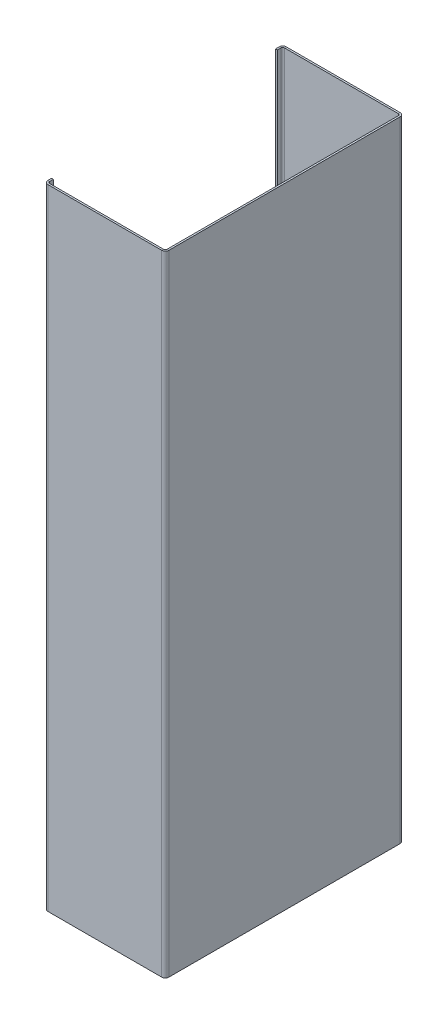
ISO-10303-21;
HEADER;
FILE_DESCRIPTION(('STEP AP214'),'2;1');
FILE_NAME('part.step','',(''),(''),'','','');
FILE_SCHEMA(('AUTOMOTIVE_DESIGN { 1 0 10303 214 1 1 1 1 }'));
ENDSEC;
DATA;
#1=APPLICATION_CONTEXT('core data for automotive mechanical design processes');
#2=APPLICATION_PROTOCOL_DEFINITION('international standard','automotive_design',2000,#1);
#3=PRODUCT_CONTEXT('',#1,'mechanical');
#4=PRODUCT('Part','Part','',(#3));
#5=PRODUCT_RELATED_PRODUCT_CATEGORY('part','',(#4));
#6=PRODUCT_DEFINITION_FORMATION('','',#4);
#7=PRODUCT_DEFINITION_CONTEXT('part definition',#1,'design');
#8=PRODUCT_DEFINITION('design','',#6,#7);
#9=PRODUCT_DEFINITION_SHAPE('','',#8);
#10=(LENGTH_UNIT() NAMED_UNIT(*) SI_UNIT(.MILLI.,.METRE.));
#11=(NAMED_UNIT(*) PLANE_ANGLE_UNIT() SI_UNIT($,.RADIAN.));
#12=(NAMED_UNIT(*) SI_UNIT($,.STERADIAN.) SOLID_ANGLE_UNIT());
#13=UNCERTAINTY_MEASURE_WITH_UNIT(LENGTH_MEASURE(1.E-05),#10,'distance_accuracy_value','');
#14=(GEOMETRIC_REPRESENTATION_CONTEXT(3) GLOBAL_UNCERTAINTY_ASSIGNED_CONTEXT((#13)) GLOBAL_UNIT_ASSIGNED_CONTEXT((#10,
#11,#12)) REPRESENTATION_CONTEXT('',''));
#15=CARTESIAN_POINT('',(0.,0.,0.));
#16=DIRECTION('',(0.,0.,1.));
#17=DIRECTION('',(1.,0.,0.));
#18=AXIS2_PLACEMENT_3D('',#15,#16,#17);
#19=CARTESIAN_POINT('',(-50.,260.,47.75));
#20=DIRECTION('',(0.,1.,0.));
#21=DIRECTION('',(0.,0.,1.));
#22=AXIS2_PLACEMENT_3D('',#19,#20,#21);
#23=PLANE('',#22);
#24=DIRECTION('',(1.,0.,0.));
#25=VECTOR('',#24,1.);
#26=CARTESIAN_POINT('',(-50.,260.,47.75));
#27=LINE('',#26,#25);
#28=CARTESIAN_POINT('',(-50.,260.,47.75));
#29=VERTEX_POINT('',#28);
#30=CARTESIAN_POINT('',(-49.25,260.,47.75));
#31=VERTEX_POINT('',#30);
#32=EDGE_CURVE('E11',#29,#31,#27,.T.);
#33=ORIENTED_EDGE('',*,*,#32,.F.);
#34=CARTESIAN_POINT('',(-48.5,260.,47.75));
#35=DIRECTION('',(0.,-1.,0.));
#36=DIRECTION('',(0.,0.,-1.));
#37=AXIS2_PLACEMENT_3D('',#34,#35,#36);
#38=CIRCLE('',#37,1.5);
#39=CARTESIAN_POINT('',(-48.5,260.,49.25));
#40=VERTEX_POINT('',#39);
#41=EDGE_CURVE('E364',#29,#40,#38,.F.);
#42=ORIENTED_EDGE('',*,*,#41,.T.);
#43=DIRECTION('',(0.,0.,1.));
#44=VECTOR('',#43,1.);
#45=CARTESIAN_POINT('',(-48.5,260.,48.5));
#46=LINE('',#45,#44);
#47=CARTESIAN_POINT('',(-48.5,260.,48.5));
#48=VERTEX_POINT('',#47);
#49=EDGE_CURVE('E47',#48,#40,#46,.T.);
#50=ORIENTED_EDGE('',*,*,#49,.F.);
#51=CARTESIAN_POINT('',(-48.5,260.,47.75));
#52=DIRECTION('',(0.,1.,0.));
#53=DIRECTION('',(1.,0.,0.));
#54=AXIS2_PLACEMENT_3D('',#51,#52,#53);
#55=CIRCLE('',#54,0.75);
#56=EDGE_CURVE('E439',#31,#48,#55,.T.);
#57=ORIENTED_EDGE('',*,*,#56,.F.);
#58=EDGE_LOOP('',(#33,#42,#50,#57));
#59=FACE_BOUND('',#58,.T.);
#60=ADVANCED_FACE('F39',(#59),#23,.T.);
#61=CARTESIAN_POINT('',(-48.5,260.,48.5));
#62=DIRECTION('',(0.,1.,0.));
#63=DIRECTION('',(0.,0.,1.));
#64=AXIS2_PLACEMENT_3D('',#61,#62,#63);
#65=PLANE('',#64);
#66=DIRECTION('',(0.,0.,1.));
#67=VECTOR('',#66,1.);
#68=CARTESIAN_POINT('',(-50.,260.,49.25));
#69=LINE('',#68,#67);
#70=CARTESIAN_POINT('',(-50.,260.,46.25));
#71=VERTEX_POINT('',#70);
#72=EDGE_CURVE('E368',#71,#29,#69,.T.);
#73=ORIENTED_EDGE('',*,*,#72,.T.);
#74=ORIENTED_EDGE('',*,*,#32,.T.);
#75=DIRECTION('',(0.,0.,-1.));
#76=VECTOR('',#75,1.);
#77=CARTESIAN_POINT('',(-49.25,260.,49.25));
#78=LINE('',#77,#76);
#79=CARTESIAN_POINT('',(-49.25,260.,46.25));
#80=VERTEX_POINT('',#79);
#81=EDGE_CURVE('E441',#80,#31,#78,.F.);
#82=ORIENTED_EDGE('',*,*,#81,.F.);
#83=DIRECTION('',(1.,0.,0.));
#84=VECTOR('',#83,1.);
#85=CARTESIAN_POINT('',(-50.,260.,46.25));
#86=LINE('',#85,#84);
#87=EDGE_CURVE('E444',#71,#80,#86,.T.);
#88=ORIENTED_EDGE('',*,*,#87,.F.);
#89=EDGE_LOOP('',(#73,#74,#82,#88));
#90=FACE_BOUND('',#89,.T.);
#91=ADVANCED_FACE('F450',(#90),#65,.T.);
#92=CARTESIAN_POINT('',(-48.5,0.,49.25));
#93=DIRECTION('',(0.,-1.,0.));
#94=DIRECTION('',(0.,0.,-1.));
#95=AXIS2_PLACEMENT_3D('',#92,#93,#94);
#96=PLANE('',#95);
#97=DIRECTION('',(0.,0.,-1.));
#98=VECTOR('',#97,1.);
#99=CARTESIAN_POINT('',(-48.5,0.,49.25));
#100=LINE('',#99,#98);
#101=CARTESIAN_POINT('',(-48.5,0.,49.25));
#102=VERTEX_POINT('',#101);
#103=CARTESIAN_POINT('',(-48.5,0.,48.5));
#104=VERTEX_POINT('',#103);
#105=EDGE_CURVE('E348',#102,#104,#100,.T.);
#106=ORIENTED_EDGE('',*,*,#105,.F.);
#107=CARTESIAN_POINT('',(-48.5,0.,47.75));
#108=DIRECTION('',(0.,-1.,0.));
#109=DIRECTION('',(0.,0.,-1.));
#110=AXIS2_PLACEMENT_3D('',#107,#108,#109);
#111=CIRCLE('',#110,1.5);
#112=CARTESIAN_POINT('',(-50.,0.,47.75));
#113=VERTEX_POINT('',#112);
#114=EDGE_CURVE('E264',#113,#102,#111,.F.);
#115=ORIENTED_EDGE('',*,*,#114,.F.);
#116=DIRECTION('',(-1.,0.,0.));
#117=VECTOR('',#116,1.);
#118=CARTESIAN_POINT('',(-49.25,0.,47.75));
#119=LINE('',#118,#117);
#120=CARTESIAN_POINT('',(-49.25,0.,47.75));
#121=VERTEX_POINT('',#120);
#122=EDGE_CURVE('E346',#121,#113,#119,.T.);
#123=ORIENTED_EDGE('',*,*,#122,.F.);
#124=CARTESIAN_POINT('',(-48.5,0.,47.75));
#125=DIRECTION('',(0.,1.,0.));
#126=DIRECTION('',(1.,0.,0.));
#127=AXIS2_PLACEMENT_3D('',#124,#125,#126);
#128=CIRCLE('',#127,0.75);
#129=EDGE_CURVE('E252',#121,#104,#128,.T.);
#130=ORIENTED_EDGE('',*,*,#129,.T.);
#131=EDGE_LOOP('',(#106,#115,#123,#130));
#132=FACE_BOUND('',#131,.T.);
#133=ADVANCED_FACE('F457',(#132),#96,.T.);
#134=CARTESIAN_POINT('',(-49.25,0.,47.75));
#135=DIRECTION('',(0.,-1.,0.));
#136=DIRECTION('',(0.,0.,-1.));
#137=AXIS2_PLACEMENT_3D('',#134,#135,#136);
#138=PLANE('',#137);
#139=DIRECTION('',(1.,0.,0.));
#140=VECTOR('',#139,1.);
#141=CARTESIAN_POINT('',(0.,0.,49.25));
#142=LINE('',#141,#140);
#143=CARTESIAN_POINT('',(-1.49999999999998,0.,49.25));
#144=VERTEX_POINT('',#143);
#145=EDGE_CURVE('E267',#102,#144,#142,.T.);
#146=ORIENTED_EDGE('',*,*,#145,.F.);
#147=ORIENTED_EDGE('',*,*,#105,.T.);
#148=DIRECTION('',(1.,0.,0.));
#149=VECTOR('',#148,1.);
#150=CARTESIAN_POINT('',(0.,0.,48.5));
#151=LINE('',#150,#149);
#152=CARTESIAN_POINT('',(-1.49999999999998,0.,48.5));
#153=VERTEX_POINT('',#152);
#154=EDGE_CURVE('E249',#104,#153,#151,.T.);
#155=ORIENTED_EDGE('',*,*,#154,.T.);
#156=DIRECTION('',(0.,0.,1.));
#157=VECTOR('',#156,1.);
#158=CARTESIAN_POINT('',(-1.49999999999998,0.,48.5));
#159=LINE('',#158,#157);
#160=EDGE_CURVE('E338',#153,#144,#159,.T.);
#161=ORIENTED_EDGE('',*,*,#160,.T.);
#162=EDGE_LOOP('',(#146,#147,#155,#161));
#163=FACE_BOUND('',#162,.T.);
#164=ADVANCED_FACE('F460',(#163),#138,.T.);
#165=CARTESIAN_POINT('',(-1.49999999999998,260.,49.25));
#166=DIRECTION('',(0.,1.,0.));
#167=DIRECTION('',(0.,0.,1.));
#168=AXIS2_PLACEMENT_3D('',#165,#166,#167);
#169=PLANE('',#168);
#170=DIRECTION('',(0.,0.,-1.));
#171=VECTOR('',#170,1.);
#172=CARTESIAN_POINT('',(-1.49999999999998,260.,49.25));
#173=LINE('',#172,#171);
#174=CARTESIAN_POINT('',(-1.49999999999998,260.,49.25));
#175=VERTEX_POINT('',#174);
#176=CARTESIAN_POINT('',(-1.49999999999998,260.,48.5));
#177=VERTEX_POINT('',#176);
#178=EDGE_CURVE('E344',#175,#177,#173,.T.);
#179=ORIENTED_EDGE('',*,*,#178,.F.);
#180=CARTESIAN_POINT('',(-1.49999999999998,260.,47.75));
#181=DIRECTION('',(0.,-1.,0.));
#182=DIRECTION('',(0.,0.,-1.));
#183=AXIS2_PLACEMENT_3D('',#180,#181,#182);
#184=CIRCLE('',#183,1.5);
#185=CARTESIAN_POINT('',(0.,260.,47.75));
#186=VERTEX_POINT('',#185);
#187=EDGE_CURVE('E376',#175,#186,#184,.F.);
#188=ORIENTED_EDGE('',*,*,#187,.T.);
#189=DIRECTION('',(1.,0.,0.));
#190=VECTOR('',#189,1.);
#191=CARTESIAN_POINT('',(-0.749999999999984,260.,47.75));
#192=LINE('',#191,#190);
#193=CARTESIAN_POINT('',(-0.749999999999984,260.,47.75));
#194=VERTEX_POINT('',#193);
#195=EDGE_CURVE('E342',#194,#186,#192,.T.);
#196=ORIENTED_EDGE('',*,*,#195,.F.);
#197=CARTESIAN_POINT('',(-1.49999999999998,260.,47.75));
#198=DIRECTION('',(0.,1.,0.));
#199=DIRECTION('',(1.,0.,0.));
#200=AXIS2_PLACEMENT_3D('',#197,#198,#199);
#201=CIRCLE('',#200,0.75);
#202=EDGE_CURVE('E435',#177,#194,#201,.T.);
#203=ORIENTED_EDGE('',*,*,#202,.F.);
#204=EDGE_LOOP('',(#179,#188,#196,#203));
#205=FACE_BOUND('',#204,.T.);
#206=ADVANCED_FACE('F480',(#205),#169,.T.);
#207=CARTESIAN_POINT('',(-0.749999999999984,260.,47.75));
#208=DIRECTION('',(0.,1.,0.));
#209=DIRECTION('',(0.,0.,1.));
#210=AXIS2_PLACEMENT_3D('',#207,#208,#209);
#211=PLANE('',#210);
#212=DIRECTION('',(1.,0.,0.));
#213=VECTOR('',#212,1.);
#214=CARTESIAN_POINT('',(0.,260.,49.25));
#215=LINE('',#214,#213);
#216=EDGE_CURVE('E355',#40,#175,#215,.T.);
#217=ORIENTED_EDGE('',*,*,#216,.T.);
#218=ORIENTED_EDGE('',*,*,#178,.T.);
#219=DIRECTION('',(1.,0.,0.));
#220=VECTOR('',#219,1.);
#221=CARTESIAN_POINT('',(0.,260.,48.5));
#222=LINE('',#221,#220);
#223=EDGE_CURVE('E358',#48,#177,#222,.T.);
#224=ORIENTED_EDGE('',*,*,#223,.F.);
#225=ORIENTED_EDGE('',*,*,#49,.T.);
#226=EDGE_LOOP('',(#217,#218,#224,#225));
#227=FACE_BOUND('',#226,.T.);
#228=ADVANCED_FACE('F353',(#227),#211,.T.);
#229=CARTESIAN_POINT('',(0.,0.,47.75));
#230=DIRECTION('',(0.,-1.,0.));
#231=DIRECTION('',(0.,0.,-1.));
#232=AXIS2_PLACEMENT_3D('',#229,#230,#231);
#233=PLANE('',#232);
#234=DIRECTION('',(-1.,0.,0.));
#235=VECTOR('',#234,1.);
#236=CARTESIAN_POINT('',(0.,0.,47.75));
#237=LINE('',#236,#235);
#238=CARTESIAN_POINT('',(0.,0.,47.75));
#239=VERTEX_POINT('',#238);
#240=CARTESIAN_POINT('',(-0.749999999999984,0.,47.75));
#241=VERTEX_POINT('',#240);
#242=EDGE_CURVE('E340',#239,#241,#237,.T.);
#243=ORIENTED_EDGE('',*,*,#242,.F.);
#244=CARTESIAN_POINT('',(-1.49999999999998,0.,47.75));
#245=DIRECTION('',(0.,-1.,0.));
#246=DIRECTION('',(0.,0.,-1.));
#247=AXIS2_PLACEMENT_3D('',#244,#245,#246);
#248=CIRCLE('',#247,1.5);
#249=EDGE_CURVE('E270',#144,#239,#248,.F.);
#250=ORIENTED_EDGE('',*,*,#249,.F.);
#251=ORIENTED_EDGE('',*,*,#160,.F.);
#252=CARTESIAN_POINT('',(-1.49999999999998,0.,47.75));
#253=DIRECTION('',(0.,1.,0.));
#254=DIRECTION('',(1.,0.,0.));
#255=AXIS2_PLACEMENT_3D('',#252,#253,#254);
#256=CIRCLE('',#255,0.75);
#257=EDGE_CURVE('E246',#153,#241,#256,.T.);
#258=ORIENTED_EDGE('',*,*,#257,.T.);
#259=EDGE_LOOP('',(#243,#250,#251,#258));
#260=FACE_BOUND('',#259,.T.);
#261=ADVANCED_FACE('F474',(#260),#233,.T.);
#262=CARTESIAN_POINT('',(-1.49999999999998,0.,48.5));
#263=DIRECTION('',(0.,-1.,0.));
#264=DIRECTION('',(0.,0.,-1.));
#265=AXIS2_PLACEMENT_3D('',#262,#263,#264);
#266=PLANE('',#265);
#267=DIRECTION('',(0.,0.,-1.));
#268=VECTOR('',#267,1.);
#269=CARTESIAN_POINT('',(0.,0.,-49.25));
#270=LINE('',#269,#268);
#271=CARTESIAN_POINT('',(0.,0.,-47.75));
#272=VERTEX_POINT('',#271);
#273=EDGE_CURVE('E273',#239,#272,#270,.T.);
#274=ORIENTED_EDGE('',*,*,#273,.F.);
#275=ORIENTED_EDGE('',*,*,#242,.T.);
#276=DIRECTION('',(0.,0.,-1.));
#277=VECTOR('',#276,1.);
#278=CARTESIAN_POINT('',(-0.750000000000038,0.,-49.25));
#279=LINE('',#278,#277);
#280=CARTESIAN_POINT('',(-0.750000000000037,0.,-47.75));
#281=VERTEX_POINT('',#280);
#282=EDGE_CURVE('E243',#241,#281,#279,.T.);
#283=ORIENTED_EDGE('',*,*,#282,.T.);
#284=DIRECTION('',(1.,0.,0.));
#285=VECTOR('',#284,1.);
#286=CARTESIAN_POINT('',(-0.750000000000037,0.,-47.75));
#287=LINE('',#286,#285);
#288=EDGE_CURVE('E334',#281,#272,#287,.T.);
#289=ORIENTED_EDGE('',*,*,#288,.T.);
#290=EDGE_LOOP('',(#274,#275,#283,#289));
#291=FACE_BOUND('',#290,.T.);
#292=ADVANCED_FACE('F484',(#291),#266,.T.);
#293=CARTESIAN_POINT('',(0.,260.,-47.75));
#294=DIRECTION('',(0.,1.,0.));
#295=DIRECTION('',(0.,0.,1.));
#296=AXIS2_PLACEMENT_3D('',#293,#294,#295);
#297=PLANE('',#296);
#298=DIRECTION('',(-1.,0.,0.));
#299=VECTOR('',#298,1.);
#300=CARTESIAN_POINT('',(0.,260.,-47.75));
#301=LINE('',#300,#299);
#302=CARTESIAN_POINT('',(0.,260.,-47.75));
#303=VERTEX_POINT('',#302);
#304=CARTESIAN_POINT('',(-0.750000000000037,260.,-47.75));
#305=VERTEX_POINT('',#304);
#306=EDGE_CURVE('E196',#303,#305,#301,.T.);
#307=ORIENTED_EDGE('',*,*,#306,.F.);
#308=CARTESIAN_POINT('',(-1.50000000000004,260.,-47.75));
#309=DIRECTION('',(0.,-1.,0.));
#310=DIRECTION('',(0.,0.,-1.));
#311=AXIS2_PLACEMENT_3D('',#308,#309,#310);
#312=CIRCLE('',#311,1.5);
#313=CARTESIAN_POINT('',(-1.50000000000004,260.,-49.25));
#314=VERTEX_POINT('',#313);
#315=EDGE_CURVE('E200',#303,#314,#312,.F.);
#316=ORIENTED_EDGE('',*,*,#315,.T.);
#317=DIRECTION('',(0.,0.,-1.));
#318=VECTOR('',#317,1.);
#319=CARTESIAN_POINT('',(-1.50000000000004,260.,-48.5));
#320=LINE('',#319,#318);
#321=CARTESIAN_POINT('',(-1.50000000000004,260.,-48.5));
#322=VERTEX_POINT('',#321);
#323=EDGE_CURVE('E184',#322,#314,#320,.T.);
#324=ORIENTED_EDGE('',*,*,#323,.F.);
#325=CARTESIAN_POINT('',(-1.50000000000004,260.,-47.75));
#326=DIRECTION('',(0.,1.,0.));
#327=DIRECTION('',(1.,0.,0.));
#328=AXIS2_PLACEMENT_3D('',#325,#326,#327);
#329=CIRCLE('',#328,0.75);
#330=EDGE_CURVE('E397',#305,#322,#329,.T.);
#331=ORIENTED_EDGE('',*,*,#330,.F.);
#332=EDGE_LOOP('',(#307,#316,#324,#331));
#333=FACE_BOUND('',#332,.T.);
#334=ADVANCED_FACE('F202',(#333),#297,.T.);
#335=CARTESIAN_POINT('',(-1.50000000000004,260.,-48.5));
#336=DIRECTION('',(0.,1.,0.));
#337=DIRECTION('',(0.,0.,1.));
#338=AXIS2_PLACEMENT_3D('',#335,#336,#337);
#339=PLANE('',#338);
#340=DIRECTION('',(0.,0.,-1.));
#341=VECTOR('',#340,1.);
#342=CARTESIAN_POINT('',(0.,260.,-49.25));
#343=LINE('',#342,#341);
#344=EDGE_CURVE('E206',#186,#303,#343,.T.);
#345=ORIENTED_EDGE('',*,*,#344,.T.);
#346=ORIENTED_EDGE('',*,*,#306,.T.);
#347=DIRECTION('',(0.,0.,-1.));
#348=VECTOR('',#347,1.);
#349=CARTESIAN_POINT('',(-0.750000000000038,260.,-49.25));
#350=LINE('',#349,#348);
#351=EDGE_CURVE('E432',#194,#305,#350,.T.);
#352=ORIENTED_EDGE('',*,*,#351,.F.);
#353=ORIENTED_EDGE('',*,*,#195,.T.);
#354=EDGE_LOOP('',(#345,#346,#352,#353));
#355=FACE_BOUND('',#354,.T.);
#356=ADVANCED_FACE('F384',(#355),#339,.T.);
#357=CARTESIAN_POINT('',(-1.50000000000004,0.,-49.25));
#358=DIRECTION('',(0.,-1.,0.));
#359=DIRECTION('',(0.,0.,-1.));
#360=AXIS2_PLACEMENT_3D('',#357,#358,#359);
#361=PLANE('',#360);
#362=DIRECTION('',(0.,0.,1.));
#363=VECTOR('',#362,1.);
#364=CARTESIAN_POINT('',(-1.50000000000004,0.,-49.25));
#365=LINE('',#364,#363);
#366=CARTESIAN_POINT('',(-1.50000000000004,0.,-49.25));
#367=VERTEX_POINT('',#366);
#368=CARTESIAN_POINT('',(-1.50000000000004,0.,-48.5));
#369=VERTEX_POINT('',#368);
#370=EDGE_CURVE('E197',#367,#369,#365,.T.);
#371=ORIENTED_EDGE('',*,*,#370,.F.);
#372=CARTESIAN_POINT('',(-1.50000000000004,0.,-47.75));
#373=DIRECTION('',(0.,-1.,0.));
#374=DIRECTION('',(0.,0.,-1.));
#375=AXIS2_PLACEMENT_3D('',#372,#373,#374);
#376=CIRCLE('',#375,1.5);
#377=EDGE_CURVE('E213',#272,#367,#376,.F.);
#378=ORIENTED_EDGE('',*,*,#377,.F.);
#379=ORIENTED_EDGE('',*,*,#288,.F.);
#380=CARTESIAN_POINT('',(-1.50000000000004,0.,-47.75));
#381=DIRECTION('',(0.,1.,0.));
#382=DIRECTION('',(1.,0.,0.));
#383=AXIS2_PLACEMENT_3D('',#380,#381,#382);
#384=CIRCLE('',#383,0.75);
#385=EDGE_CURVE('E240',#281,#369,#384,.T.);
#386=ORIENTED_EDGE('',*,*,#385,.T.);
#387=EDGE_LOOP('',(#371,#378,#379,#386));
#388=FACE_BOUND('',#387,.T.);
#389=ADVANCED_FACE('F391',(#388),#361,.T.);
#390=CARTESIAN_POINT('',(-0.750000000000037,0.,-47.75));
#391=DIRECTION('',(0.,-1.,0.));
#392=DIRECTION('',(0.,0.,-1.));
#393=AXIS2_PLACEMENT_3D('',#390,#391,#392);
#394=PLANE('',#393);
#395=DIRECTION('',(-1.,0.,0.));
#396=VECTOR('',#395,1.);
#397=CARTESIAN_POINT('',(-50.,0.,-49.25));
#398=LINE('',#397,#396);
#399=CARTESIAN_POINT('',(-48.5,0.,-49.25));
#400=VERTEX_POINT('',#399);
#401=EDGE_CURVE('E277',#367,#400,#398,.T.);
#402=ORIENTED_EDGE('',*,*,#401,.F.);
#403=ORIENTED_EDGE('',*,*,#370,.T.);
#404=DIRECTION('',(1.,0.,0.));
#405=VECTOR('',#404,1.);
#406=CARTESIAN_POINT('',(-50.,0.,-48.5));
#407=LINE('',#406,#405);
#408=CARTESIAN_POINT('',(-48.5,0.,-48.5));
#409=VERTEX_POINT('',#408);
#410=EDGE_CURVE('E238',#369,#409,#407,.F.);
#411=ORIENTED_EDGE('',*,*,#410,.T.);
#412=DIRECTION('',(0.,0.,-1.));
#413=VECTOR('',#412,1.);
#414=CARTESIAN_POINT('',(-48.5,0.,-48.5));
#415=LINE('',#414,#413);
#416=EDGE_CURVE('E120',#409,#400,#415,.T.);
#417=ORIENTED_EDGE('',*,*,#416,.T.);
#418=EDGE_LOOP('',(#402,#403,#411,#417));
#419=FACE_BOUND('',#418,.T.);
#420=ADVANCED_FACE('F393',(#419),#394,.T.);
#421=CARTESIAN_POINT('',(-48.5,260.,-49.25));
#422=DIRECTION('',(0.,1.,0.));
#423=DIRECTION('',(0.,0.,1.));
#424=AXIS2_PLACEMENT_3D('',#421,#422,#423);
#425=PLANE('',#424);
#426=DIRECTION('',(0.,0.,1.));
#427=VECTOR('',#426,1.);
#428=CARTESIAN_POINT('',(-48.5,260.,-49.25));
#429=LINE('',#428,#427);
#430=CARTESIAN_POINT('',(-48.5,260.,-49.25));
#431=VERTEX_POINT('',#430);
#432=CARTESIAN_POINT('',(-48.5,260.,-48.5));
#433=VERTEX_POINT('',#432);
#434=EDGE_CURVE('E332',#431,#433,#429,.T.);
#435=ORIENTED_EDGE('',*,*,#434,.F.);
#436=CARTESIAN_POINT('',(-48.5,260.,-47.75));
#437=DIRECTION('',(0.,-1.,0.));
#438=DIRECTION('',(0.,0.,-1.));
#439=AXIS2_PLACEMENT_3D('',#436,#437,#438);
#440=CIRCLE('',#439,1.5);
#441=CARTESIAN_POINT('',(-50.,260.,-47.75));
#442=VERTEX_POINT('',#441);
#443=EDGE_CURVE('E221',#431,#442,#440,.F.);
#444=ORIENTED_EDGE('',*,*,#443,.T.);
#445=DIRECTION('',(-1.,0.,0.));
#446=VECTOR('',#445,1.);
#447=CARTESIAN_POINT('',(-49.25,260.,-47.75));
#448=LINE('',#447,#446);
#449=CARTESIAN_POINT('',(-49.25,260.,-47.75));
#450=VERTEX_POINT('',#449);
#451=EDGE_CURVE('E55',#450,#442,#448,.T.);
#452=ORIENTED_EDGE('',*,*,#451,.F.);
#453=CARTESIAN_POINT('',(-48.5,260.,-47.75));
#454=DIRECTION('',(0.,1.,0.));
#455=DIRECTION('',(1.,0.,0.));
#456=AXIS2_PLACEMENT_3D('',#453,#454,#455);
#457=CIRCLE('',#456,0.75);
#458=EDGE_CURVE('E425',#433,#450,#457,.T.);
#459=ORIENTED_EDGE('',*,*,#458,.F.);
#460=EDGE_LOOP('',(#435,#444,#452,#459));
#461=FACE_BOUND('',#460,.T.);
#462=ADVANCED_FACE('F555',(#461),#425,.T.);
#463=CARTESIAN_POINT('',(-49.25,260.,-47.75));
#464=DIRECTION('',(0.,1.,0.));
#465=DIRECTION('',(0.,0.,1.));
#466=AXIS2_PLACEMENT_3D('',#463,#464,#465);
#467=PLANE('',#466);
#468=DIRECTION('',(-1.,0.,0.));
#469=VECTOR('',#468,1.);
#470=CARTESIAN_POINT('',(-50.,260.,-49.25));
#471=LINE('',#470,#469);
#472=EDGE_CURVE('E188',#314,#431,#471,.T.);
#473=ORIENTED_EDGE('',*,*,#472,.T.);
#474=ORIENTED_EDGE('',*,*,#434,.T.);
#475=DIRECTION('',(1.,0.,0.));
#476=VECTOR('',#475,1.);
#477=CARTESIAN_POINT('',(-50.,260.,-48.5));
#478=LINE('',#477,#476);
#479=EDGE_CURVE('E191',#322,#433,#478,.F.);
#480=ORIENTED_EDGE('',*,*,#479,.F.);
#481=ORIENTED_EDGE('',*,*,#323,.T.);
#482=EDGE_LOOP('',(#473,#474,#480,#481));
#483=FACE_BOUND('',#482,.T.);
#484=ADVANCED_FACE('F186',(#483),#467,.T.);
#485=CARTESIAN_POINT('',(-50.,0.,-47.75));
#486=DIRECTION('',(0.,-1.,0.));
#487=DIRECTION('',(0.,0.,-1.));
#488=AXIS2_PLACEMENT_3D('',#485,#486,#487);
#489=PLANE('',#488);
#490=DIRECTION('',(1.,0.,0.));
#491=VECTOR('',#490,1.);
#492=CARTESIAN_POINT('',(-50.,0.,-47.75));
#493=LINE('',#492,#491);
#494=CARTESIAN_POINT('',(-50.,0.,-47.75));
#495=VERTEX_POINT('',#494);
#496=CARTESIAN_POINT('',(-49.25,0.,-47.75));
#497=VERTEX_POINT('',#496);
#498=EDGE_CURVE('E127',#495,#497,#493,.T.);
#499=ORIENTED_EDGE('',*,*,#498,.F.);
#500=CARTESIAN_POINT('',(-48.5,0.,-47.75));
#501=DIRECTION('',(0.,-1.,0.));
#502=DIRECTION('',(0.,0.,-1.));
#503=AXIS2_PLACEMENT_3D('',#500,#501,#502);
#504=CIRCLE('',#503,1.5);
#505=EDGE_CURVE('E279',#400,#495,#504,.F.);
#506=ORIENTED_EDGE('',*,*,#505,.F.);
#507=ORIENTED_EDGE('',*,*,#416,.F.);
#508=CARTESIAN_POINT('',(-48.5,0.,-47.75));
#509=DIRECTION('',(0.,1.,0.));
#510=DIRECTION('',(1.,0.,0.));
#511=AXIS2_PLACEMENT_3D('',#508,#509,#510);
#512=CIRCLE('',#511,0.75);
#513=EDGE_CURVE('E236',#409,#497,#512,.T.);
#514=ORIENTED_EDGE('',*,*,#513,.T.);
#515=EDGE_LOOP('',(#499,#506,#507,#514));
#516=FACE_BOUND('',#515,.T.);
#517=ADVANCED_FACE('F408',(#516),#489,.T.);
#518=CARTESIAN_POINT('',(-48.5,0.,-48.5));
#519=DIRECTION('',(0.,-1.,0.));
#520=DIRECTION('',(0.,0.,-1.));
#521=AXIS2_PLACEMENT_3D('',#518,#519,#520);
#522=PLANE('',#521);
#523=DIRECTION('',(0.,0.,1.));
#524=VECTOR('',#523,1.);
#525=CARTESIAN_POINT('',(-50.,0.,-49.25));
#526=LINE('',#525,#524);
#527=CARTESIAN_POINT('',(-50.,0.,-46.25));
#528=VERTEX_POINT('',#527);
#529=EDGE_CURVE('E227',#495,#528,#526,.T.);
#530=ORIENTED_EDGE('',*,*,#529,.F.);
#531=ORIENTED_EDGE('',*,*,#498,.T.);
#532=DIRECTION('',(0.,0.,-1.));
#533=VECTOR('',#532,1.);
#534=CARTESIAN_POINT('',(-49.25,0.,-49.25));
#535=LINE('',#534,#533);
#536=CARTESIAN_POINT('',(-49.25,0.,-46.25));
#537=VERTEX_POINT('',#536);
#538=EDGE_CURVE('E233',#497,#537,#535,.F.);
#539=ORIENTED_EDGE('',*,*,#538,.T.);
#540=DIRECTION('',(-1.,0.,0.));
#541=VECTOR('',#540,1.);
#542=CARTESIAN_POINT('',(-49.25,0.,-46.25));
#543=LINE('',#542,#541);
#544=EDGE_CURVE('E230',#537,#528,#543,.T.);
#545=ORIENTED_EDGE('',*,*,#544,.T.);
#546=EDGE_LOOP('',(#530,#531,#539,#545));
#547=FACE_BOUND('',#546,.T.);
#548=ADVANCED_FACE('F416',(#547),#522,.T.);
#549=CARTESIAN_POINT('',(-50.,260.,-49.25));
#550=DIRECTION('',(1.,0.,0.));
#551=DIRECTION('',(0.,0.,-1.));
#552=AXIS2_PLACEMENT_3D('',#549,#550,#551);
#553=PLANE('',#552);
#554=ORIENTED_EDGE('',*,*,#529,.T.);
#555=DIRECTION('',(0.,-1.,0.));
#556=VECTOR('',#555,1.);
#557=CARTESIAN_POINT('',(-50.,260.,-46.25));
#558=LINE('',#557,#556);
#559=CARTESIAN_POINT('',(-50.,260.,-46.25));
#560=VERTEX_POINT('',#559);
#561=EDGE_CURVE('E327',#560,#528,#558,.T.);
#562=ORIENTED_EDGE('',*,*,#561,.F.);
#563=DIRECTION('',(0.,0.,1.));
#564=VECTOR('',#563,1.);
#565=CARTESIAN_POINT('',(-50.,260.,-49.25));
#566=LINE('',#565,#564);
#567=EDGE_CURVE('E133',#442,#560,#566,.T.);
#568=ORIENTED_EDGE('',*,*,#567,.F.);
#569=DIRECTION('',(0.,-1.,0.));
#570=VECTOR('',#569,1.);
#571=CARTESIAN_POINT('',(-50.,260.,-47.75));
#572=LINE('',#571,#570);
#573=EDGE_CURVE('E223',#442,#495,#572,.T.);
#574=ORIENTED_EDGE('',*,*,#573,.T.);
#575=EDGE_LOOP('',(#554,#562,#568,#574));
#576=FACE_BOUND('',#575,.T.);
#577=ADVANCED_FACE('F414',(#576),#553,.F.);
#578=CARTESIAN_POINT('',(-49.25,260.,-46.25));
#579=DIRECTION('',(0.,0.,1.));
#580=DIRECTION('',(1.,0.,0.));
#581=AXIS2_PLACEMENT_3D('',#578,#579,#580);
#582=PLANE('',#581);
#583=ORIENTED_EDGE('',*,*,#544,.F.);
#584=DIRECTION('',(0.,-1.,0.));
#585=VECTOR('',#584,1.);
#586=CARTESIAN_POINT('',(-49.25,260.,-46.25));
#587=LINE('',#586,#585);
#588=CARTESIAN_POINT('',(-49.25,260.,-46.25));
#589=VERTEX_POINT('',#588);
#590=EDGE_CURVE('E325',#589,#537,#587,.T.);
#591=ORIENTED_EDGE('',*,*,#590,.F.);
#592=DIRECTION('',(-1.,0.,0.));
#593=VECTOR('',#592,1.);
#594=CARTESIAN_POINT('',(-49.25,260.,-46.25));
#595=LINE('',#594,#593);
#596=EDGE_CURVE('E421',#589,#560,#595,.T.);
#597=ORIENTED_EDGE('',*,*,#596,.T.);
#598=ORIENTED_EDGE('',*,*,#561,.T.);
#599=EDGE_LOOP('',(#583,#591,#597,#598));
#600=FACE_BOUND('',#599,.T.);
#601=ADVANCED_FACE('F419',(#600),#582,.T.);
#602=CARTESIAN_POINT('',(-49.25,260.,-49.25));
#603=DIRECTION('',(1.,0.,0.));
#604=DIRECTION('',(0.,0.,-1.));
#605=AXIS2_PLACEMENT_3D('',#602,#603,#604);
#606=PLANE('',#605);
#607=ORIENTED_EDGE('',*,*,#538,.F.);
#608=DIRECTION('',(0.,-1.,0.));
#609=VECTOR('',#608,1.);
#610=CARTESIAN_POINT('',(-49.25,260.,-47.75));
#611=LINE('',#610,#609);
#612=EDGE_CURVE('E322',#450,#497,#611,.T.);
#613=ORIENTED_EDGE('',*,*,#612,.F.);
#614=DIRECTION('',(0.,0.,-1.));
#615=VECTOR('',#614,1.);
#616=CARTESIAN_POINT('',(-49.25,260.,-49.25));
#617=LINE('',#616,#615);
#618=EDGE_CURVE('E423',#450,#589,#617,.F.);
#619=ORIENTED_EDGE('',*,*,#618,.T.);
#620=ORIENTED_EDGE('',*,*,#590,.T.);
#621=EDGE_LOOP('',(#607,#613,#619,#620));
#622=FACE_BOUND('',#621,.T.);
#623=ADVANCED_FACE('F611',(#622),#606,.T.);
#624=CARTESIAN_POINT('',(-48.5,260.,-47.75));
#625=DIRECTION('',(0.,-1.,0.));
#626=DIRECTION('',(0.,0.,-1.));
#627=AXIS2_PLACEMENT_3D('',#624,#625,#626);
#628=CYLINDRICAL_SURFACE('',#627,0.75);
#629=ORIENTED_EDGE('',*,*,#513,.F.);
#630=DIRECTION('',(0.,-1.,0.));
#631=VECTOR('',#630,1.);
#632=CARTESIAN_POINT('',(-48.5,260.,-48.5));
#633=LINE('',#632,#631);
#634=EDGE_CURVE('E319',#433,#409,#633,.T.);
#635=ORIENTED_EDGE('',*,*,#634,.F.);
#636=ORIENTED_EDGE('',*,*,#458,.T.);
#637=ORIENTED_EDGE('',*,*,#612,.T.);
#638=EDGE_LOOP('',(#629,#635,#636,#637));
#639=FACE_BOUND('',#638,.T.);
#640=ADVANCED_FACE('F405',(#639),#628,.F.);
#641=CARTESIAN_POINT('',(-50.,260.,-48.5));
#642=DIRECTION('',(0.,0.,1.));
#643=DIRECTION('',(1.,0.,0.));
#644=AXIS2_PLACEMENT_3D('',#641,#642,#643);
#645=PLANE('',#644);
#646=ORIENTED_EDGE('',*,*,#410,.F.);
#647=DIRECTION('',(0.,-1.,0.));
#648=VECTOR('',#647,1.);
#649=CARTESIAN_POINT('',(-1.50000000000004,260.,-48.5));
#650=LINE('',#649,#648);
#651=EDGE_CURVE('E316',#322,#369,#650,.T.);
#652=ORIENTED_EDGE('',*,*,#651,.F.);
#653=ORIENTED_EDGE('',*,*,#479,.T.);
#654=ORIENTED_EDGE('',*,*,#634,.T.);
#655=EDGE_LOOP('',(#646,#652,#653,#654));
#656=FACE_BOUND('',#655,.T.);
#657=ADVANCED_FACE('F399',(#656),#645,.T.);
#658=CARTESIAN_POINT('',(-1.50000000000004,260.,-47.75));
#659=DIRECTION('',(0.,-1.,0.));
#660=DIRECTION('',(0.,0.,-1.));
#661=AXIS2_PLACEMENT_3D('',#658,#659,#660);
#662=CYLINDRICAL_SURFACE('',#661,0.75);
#663=ORIENTED_EDGE('',*,*,#385,.F.);
#664=DIRECTION('',(0.,-1.,0.));
#665=VECTOR('',#664,1.);
#666=CARTESIAN_POINT('',(-0.750000000000037,260.,-47.75));
#667=LINE('',#666,#665);
#668=EDGE_CURVE('E313',#305,#281,#667,.T.);
#669=ORIENTED_EDGE('',*,*,#668,.F.);
#670=ORIENTED_EDGE('',*,*,#330,.T.);
#671=ORIENTED_EDGE('',*,*,#651,.T.);
#672=EDGE_LOOP('',(#663,#669,#670,#671));
#673=FACE_BOUND('',#672,.T.);
#674=ADVANCED_FACE('F396',(#673),#662,.F.);
#675=CARTESIAN_POINT('',(-0.750000000000038,260.,-49.25));
#676=DIRECTION('',(-1.,0.,0.));
#677=DIRECTION('',(0.,0.,1.));
#678=AXIS2_PLACEMENT_3D('',#675,#676,#677);
#679=PLANE('',#678);
#680=ORIENTED_EDGE('',*,*,#282,.F.);
#681=DIRECTION('',(0.,-1.,0.));
#682=VECTOR('',#681,1.);
#683=CARTESIAN_POINT('',(-0.749999999999984,260.,47.75));
#684=LINE('',#683,#682);
#685=EDGE_CURVE('E310',#194,#241,#684,.T.);
#686=ORIENTED_EDGE('',*,*,#685,.F.);
#687=ORIENTED_EDGE('',*,*,#351,.T.);
#688=ORIENTED_EDGE('',*,*,#668,.T.);
#689=EDGE_LOOP('',(#680,#686,#687,#688));
#690=FACE_BOUND('',#689,.T.);
#691=ADVANCED_FACE('F482',(#690),#679,.T.);
#692=CARTESIAN_POINT('',(-1.49999999999998,260.,47.75));
#693=DIRECTION('',(0.,-1.,0.));
#694=DIRECTION('',(0.,0.,-1.));
#695=AXIS2_PLACEMENT_3D('',#692,#693,#694);
#696=CYLINDRICAL_SURFACE('',#695,0.75);
#697=ORIENTED_EDGE('',*,*,#257,.F.);
#698=DIRECTION('',(0.,-1.,0.));
#699=VECTOR('',#698,1.);
#700=CARTESIAN_POINT('',(-1.49999999999998,260.,48.5));
#701=LINE('',#700,#699);
#702=EDGE_CURVE('E307',#177,#153,#701,.T.);
#703=ORIENTED_EDGE('',*,*,#702,.F.);
#704=ORIENTED_EDGE('',*,*,#202,.T.);
#705=ORIENTED_EDGE('',*,*,#685,.T.);
#706=EDGE_LOOP('',(#697,#703,#704,#705));
#707=FACE_BOUND('',#706,.T.);
#708=ADVANCED_FACE('F470',(#707),#696,.F.);
#709=CARTESIAN_POINT('',(0.,260.,48.5));
#710=DIRECTION('',(0.,0.,-1.));
#711=DIRECTION('',(-1.,0.,0.));
#712=AXIS2_PLACEMENT_3D('',#709,#710,#711);
#713=PLANE('',#712);
#714=ORIENTED_EDGE('',*,*,#154,.F.);
#715=DIRECTION('',(0.,-1.,0.));
#716=VECTOR('',#715,1.);
#717=CARTESIAN_POINT('',(-48.5,260.,48.5));
#718=LINE('',#717,#716);
#719=EDGE_CURVE('E304',#48,#104,#718,.T.);
#720=ORIENTED_EDGE('',*,*,#719,.F.);
#721=ORIENTED_EDGE('',*,*,#223,.T.);
#722=ORIENTED_EDGE('',*,*,#702,.T.);
#723=EDGE_LOOP('',(#714,#720,#721,#722));
#724=FACE_BOUND('',#723,.T.);
#725=ADVANCED_FACE('F465',(#724),#713,.T.);
#726=CARTESIAN_POINT('',(-48.5,260.,47.75));
#727=DIRECTION('',(0.,-1.,0.));
#728=DIRECTION('',(0.,0.,-1.));
#729=AXIS2_PLACEMENT_3D('',#726,#727,#728);
#730=CYLINDRICAL_SURFACE('',#729,0.75);
#731=ORIENTED_EDGE('',*,*,#129,.F.);
#732=DIRECTION('',(0.,-1.,0.));
#733=VECTOR('',#732,1.);
#734=CARTESIAN_POINT('',(-49.25,260.,47.75));
#735=LINE('',#734,#733);
#736=EDGE_CURVE('E301',#31,#121,#735,.T.);
#737=ORIENTED_EDGE('',*,*,#736,.F.);
#738=ORIENTED_EDGE('',*,*,#56,.T.);
#739=ORIENTED_EDGE('',*,*,#719,.T.);
#740=EDGE_LOOP('',(#731,#737,#738,#739));
#741=FACE_BOUND('',#740,.T.);
#742=ADVANCED_FACE('F463',(#741),#730,.F.);
#743=CARTESIAN_POINT('',(-49.25,260.,49.25));
#744=DIRECTION('',(1.,0.,0.));
#745=DIRECTION('',(0.,0.,-1.));
#746=AXIS2_PLACEMENT_3D('',#743,#744,#745);
#747=PLANE('',#746);
#748=DIRECTION('',(0.,0.,-1.));
#749=VECTOR('',#748,1.);
#750=CARTESIAN_POINT('',(-49.25,0.,49.25));
#751=LINE('',#750,#749);
#752=CARTESIAN_POINT('',(-49.25,0.,46.25));
#753=VERTEX_POINT('',#752);
#754=EDGE_CURVE('E255',#753,#121,#751,.F.);
#755=ORIENTED_EDGE('',*,*,#754,.F.);
#756=DIRECTION('',(0.,-1.,0.));
#757=VECTOR('',#756,1.);
#758=CARTESIAN_POINT('',(-49.25,260.,46.25));
#759=LINE('',#758,#757);
#760=EDGE_CURVE('E299',#80,#753,#759,.T.);
#761=ORIENTED_EDGE('',*,*,#760,.F.);
#762=ORIENTED_EDGE('',*,*,#81,.T.);
#763=ORIENTED_EDGE('',*,*,#736,.T.);
#764=EDGE_LOOP('',(#755,#761,#762,#763));
#765=FACE_BOUND('',#764,.T.);
#766=ADVANCED_FACE('F685',(#765),#747,.T.);
#767=CARTESIAN_POINT('',(-50.,260.,46.25));
#768=DIRECTION('',(0.,0.,-1.));
#769=DIRECTION('',(-1.,0.,0.));
#770=AXIS2_PLACEMENT_3D('',#767,#768,#769);
#771=PLANE('',#770);
#772=DIRECTION('',(1.,0.,0.));
#773=VECTOR('',#772,1.);
#774=CARTESIAN_POINT('',(-50.,0.,46.25));
#775=LINE('',#774,#773);
#776=CARTESIAN_POINT('',(-50.,0.,46.25));
#777=VERTEX_POINT('',#776);
#778=EDGE_CURVE('E258',#777,#753,#775,.T.);
#779=ORIENTED_EDGE('',*,*,#778,.F.);
#780=DIRECTION('',(0.,-1.,0.));
#781=VECTOR('',#780,1.);
#782=CARTESIAN_POINT('',(-50.,260.,46.25));
#783=LINE('',#782,#781);
#784=EDGE_CURVE('E297',#71,#777,#783,.T.);
#785=ORIENTED_EDGE('',*,*,#784,.F.);
#786=ORIENTED_EDGE('',*,*,#87,.T.);
#787=ORIENTED_EDGE('',*,*,#760,.T.);
#788=EDGE_LOOP('',(#779,#785,#786,#787));
#789=FACE_BOUND('',#788,.T.);
#790=ADVANCED_FACE('F695',(#789),#771,.T.);
#791=CARTESIAN_POINT('',(-50.,260.,49.25));
#792=DIRECTION('',(1.,0.,0.));
#793=DIRECTION('',(0.,0.,-1.));
#794=AXIS2_PLACEMENT_3D('',#791,#792,#793);
#795=PLANE('',#794);
#796=DIRECTION('',(0.,0.,1.));
#797=VECTOR('',#796,1.);
#798=CARTESIAN_POINT('',(-50.,0.,49.25));
#799=LINE('',#798,#797);
#800=EDGE_CURVE('E261',#777,#113,#799,.T.);
#801=ORIENTED_EDGE('',*,*,#800,.T.);
#802=DIRECTION('',(0.,-1.,0.));
#803=VECTOR('',#802,1.);
#804=CARTESIAN_POINT('',(-50.,260.,47.75));
#805=LINE('',#804,#803);
#806=EDGE_CURVE('E294',#29,#113,#805,.T.);
#807=ORIENTED_EDGE('',*,*,#806,.F.);
#808=ORIENTED_EDGE('',*,*,#72,.F.);
#809=ORIENTED_EDGE('',*,*,#784,.T.);
#810=EDGE_LOOP('',(#801,#807,#808,#809));
#811=FACE_BOUND('',#810,.T.);
#812=ADVANCED_FACE('F454',(#811),#795,.F.);
#813=CARTESIAN_POINT('',(-48.5,260.,47.75));
#814=DIRECTION('',(0.,-1.,0.));
#815=DIRECTION('',(0.,0.,-1.));
#816=AXIS2_PLACEMENT_3D('',#813,#814,#815);
#817=CYLINDRICAL_SURFACE('',#816,1.5);
#818=ORIENTED_EDGE('',*,*,#114,.T.);
#819=DIRECTION('',(0.,-1.,0.));
#820=VECTOR('',#819,1.);
#821=CARTESIAN_POINT('',(-48.5,260.,49.25));
#822=LINE('',#821,#820);
#823=EDGE_CURVE('E291',#40,#102,#822,.T.);
#824=ORIENTED_EDGE('',*,*,#823,.F.);
#825=ORIENTED_EDGE('',*,*,#41,.F.);
#826=ORIENTED_EDGE('',*,*,#806,.T.);
#827=EDGE_LOOP('',(#818,#824,#825,#826));
#828=FACE_BOUND('',#827,.T.);
#829=ADVANCED_FACE('F370',(#828),#817,.T.);
#830=CARTESIAN_POINT('',(0.,260.,49.25));
#831=DIRECTION('',(0.,0.,-1.));
#832=DIRECTION('',(-1.,0.,0.));
#833=AXIS2_PLACEMENT_3D('',#830,#831,#832);
#834=PLANE('',#833);
#835=ORIENTED_EDGE('',*,*,#145,.T.);
#836=DIRECTION('',(0.,-1.,0.));
#837=VECTOR('',#836,1.);
#838=CARTESIAN_POINT('',(-1.49999999999998,260.,49.25));
#839=LINE('',#838,#837);
#840=EDGE_CURVE('E288',#175,#144,#839,.T.);
#841=ORIENTED_EDGE('',*,*,#840,.F.);
#842=ORIENTED_EDGE('',*,*,#216,.F.);
#843=ORIENTED_EDGE('',*,*,#823,.T.);
#844=EDGE_LOOP('',(#835,#841,#842,#843));
#845=FACE_BOUND('',#844,.T.);
#846=ADVANCED_FACE('F374',(#845),#834,.F.);
#847=CARTESIAN_POINT('',(-1.49999999999998,260.,47.75));
#848=DIRECTION('',(0.,-1.,0.));
#849=DIRECTION('',(0.,0.,-1.));
#850=AXIS2_PLACEMENT_3D('',#847,#848,#849);
#851=CYLINDRICAL_SURFACE('',#850,1.5);
#852=ORIENTED_EDGE('',*,*,#249,.T.);
#853=DIRECTION('',(0.,-1.,0.));
#854=VECTOR('',#853,1.);
#855=CARTESIAN_POINT('',(0.,260.,47.75));
#856=LINE('',#855,#854);
#857=EDGE_CURVE('E285',#186,#239,#856,.T.);
#858=ORIENTED_EDGE('',*,*,#857,.F.);
#859=ORIENTED_EDGE('',*,*,#187,.F.);
#860=ORIENTED_EDGE('',*,*,#840,.T.);
#861=EDGE_LOOP('',(#852,#858,#859,#860));
#862=FACE_BOUND('',#861,.T.);
#863=ADVANCED_FACE('F477',(#862),#851,.T.);
#864=CARTESIAN_POINT('',(0.,260.,-49.25));
#865=DIRECTION('',(-1.,0.,0.));
#866=DIRECTION('',(0.,0.,1.));
#867=AXIS2_PLACEMENT_3D('',#864,#865,#866);
#868=PLANE('',#867);
#869=ORIENTED_EDGE('',*,*,#273,.T.);
#870=DIRECTION('',(0.,-1.,0.));
#871=VECTOR('',#870,1.);
#872=CARTESIAN_POINT('',(0.,260.,-47.75));
#873=LINE('',#872,#871);
#874=EDGE_CURVE('E215',#303,#272,#873,.T.);
#875=ORIENTED_EDGE('',*,*,#874,.F.);
#876=ORIENTED_EDGE('',*,*,#344,.F.);
#877=ORIENTED_EDGE('',*,*,#857,.T.);
#878=EDGE_LOOP('',(#869,#875,#876,#877));
#879=FACE_BOUND('',#878,.T.);
#880=ADVANCED_FACE('F388',(#879),#868,.F.);
#881=CARTESIAN_POINT('',(-1.50000000000004,260.,-47.75));
#882=DIRECTION('',(0.,-1.,0.));
#883=DIRECTION('',(0.,0.,-1.));
#884=AXIS2_PLACEMENT_3D('',#881,#882,#883);
#885=CYLINDRICAL_SURFACE('',#884,1.5);
#886=ORIENTED_EDGE('',*,*,#377,.T.);
#887=DIRECTION('',(0.,-1.,0.));
#888=VECTOR('',#887,1.);
#889=CARTESIAN_POINT('',(-1.50000000000004,260.,-49.25));
#890=LINE('',#889,#888);
#891=EDGE_CURVE('E210',#314,#367,#890,.T.);
#892=ORIENTED_EDGE('',*,*,#891,.F.);
#893=ORIENTED_EDGE('',*,*,#315,.F.);
#894=ORIENTED_EDGE('',*,*,#874,.T.);
#895=EDGE_LOOP('',(#886,#892,#893,#894));
#896=FACE_BOUND('',#895,.T.);
#897=ADVANCED_FACE('F211',(#896),#885,.T.);
#898=CARTESIAN_POINT('',(-50.,260.,-49.25));
#899=DIRECTION('',(0.,0.,1.));
#900=DIRECTION('',(1.,0.,0.));
#901=AXIS2_PLACEMENT_3D('',#898,#899,#900);
#902=PLANE('',#901);
#903=ORIENTED_EDGE('',*,*,#401,.T.);
#904=DIRECTION('',(0.,-1.,0.));
#905=VECTOR('',#904,1.);
#906=CARTESIAN_POINT('',(-48.5,260.,-49.25));
#907=LINE('',#906,#905);
#908=EDGE_CURVE('E216',#431,#400,#907,.T.);
#909=ORIENTED_EDGE('',*,*,#908,.F.);
#910=ORIENTED_EDGE('',*,*,#472,.F.);
#911=ORIENTED_EDGE('',*,*,#891,.T.);
#912=EDGE_LOOP('',(#903,#909,#910,#911));
#913=FACE_BOUND('',#912,.T.);
#914=ADVANCED_FACE('F218',(#913),#902,.F.);
#915=CARTESIAN_POINT('',(-48.5,260.,-47.75));
#916=DIRECTION('',(0.,-1.,0.));
#917=DIRECTION('',(0.,0.,-1.));
#918=AXIS2_PLACEMENT_3D('',#915,#916,#917);
#919=CYLINDRICAL_SURFACE('',#918,1.5);
#920=ORIENTED_EDGE('',*,*,#505,.T.);
#921=ORIENTED_EDGE('',*,*,#573,.F.);
#922=ORIENTED_EDGE('',*,*,#443,.F.);
#923=ORIENTED_EDGE('',*,*,#908,.T.);
#924=EDGE_LOOP('',(#920,#921,#922,#923));
#925=FACE_BOUND('',#924,.T.);
#926=ADVANCED_FACE('F411',(#925),#919,.T.);
#927=CARTESIAN_POINT('',(-48.5,260.,-47.75));
#928=DIRECTION('',(0.,1.,0.));
#929=DIRECTION('',(1.,0.,0.));
#930=AXIS2_PLACEMENT_3D('',#927,#928,#929);
#931=PLANE('',#930);
#932=ORIENTED_EDGE('',*,*,#567,.T.);
#933=ORIENTED_EDGE('',*,*,#596,.F.);
#934=ORIENTED_EDGE('',*,*,#618,.F.);
#935=ORIENTED_EDGE('',*,*,#451,.T.);
#936=EDGE_LOOP('',(#932,#933,#934,#935));
#937=FACE_BOUND('',#936,.T.);
#938=ADVANCED_FACE('F779',(#937),#931,.T.);
#939=CARTESIAN_POINT('',(-48.5,0.,-47.75));
#940=DIRECTION('',(0.,1.,0.));
#941=DIRECTION('',(1.,0.,0.));
#942=AXIS2_PLACEMENT_3D('',#939,#940,#941);
#943=PLANE('',#942);
#944=ORIENTED_EDGE('',*,*,#754,.T.);
#945=ORIENTED_EDGE('',*,*,#122,.T.);
#946=ORIENTED_EDGE('',*,*,#800,.F.);
#947=ORIENTED_EDGE('',*,*,#778,.T.);
#948=EDGE_LOOP('',(#944,#945,#946,#947));
#949=FACE_BOUND('',#948,.T.);
#950=ADVANCED_FACE('F789',(#949),#943,.F.);
#951=CLOSED_SHELL('',(#60,#91,#133,#164,#206,#228,#261,#292,#334,#356,#389,#420,#462,#484,#517,
#548,#577,#601,#623,#640,#657,#674,#691,#708,#725,#742,#766,#790,#812,#829,#846,#863,#880,#897,
#914,#926,#938,#950));
#952=MANIFOLD_SOLID_BREP('B2',#951);
#953=ADVANCED_BREP_SHAPE_REPRESENTATION('',(#18,#952),#14);
#954=SHAPE_DEFINITION_REPRESENTATION(#9,#953);
ENDSEC;
END-ISO-10303-21;
